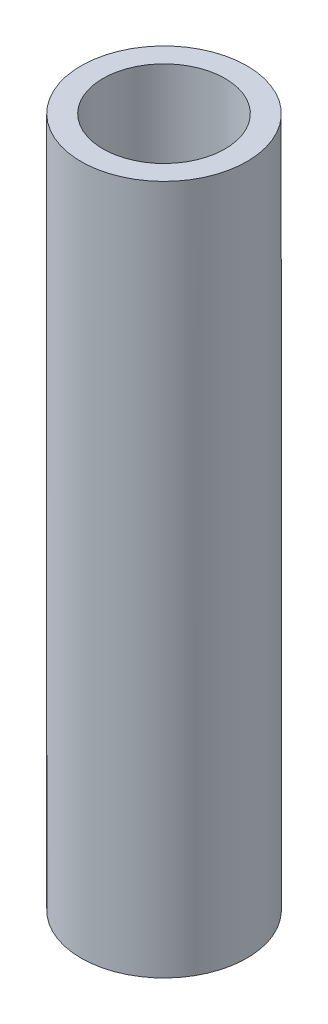
ISO-10303-21;
HEADER;
FILE_DESCRIPTION(('STEP AP214'),'2;1');
FILE_NAME('part.step','',(''),(''),'','','');
FILE_SCHEMA(('AUTOMOTIVE_DESIGN { 1 0 10303 214 1 1 1 1 }'));
ENDSEC;
DATA;
#1=APPLICATION_CONTEXT('core data for automotive mechanical design processes');
#2=APPLICATION_PROTOCOL_DEFINITION('international standard','automotive_design',2000,#1);
#3=PRODUCT_CONTEXT('',#1,'mechanical');
#4=PRODUCT('Part','Part','',(#3));
#5=PRODUCT_RELATED_PRODUCT_CATEGORY('part','',(#4));
#6=PRODUCT_DEFINITION_FORMATION('','',#4);
#7=PRODUCT_DEFINITION_CONTEXT('part definition',#1,'design');
#8=PRODUCT_DEFINITION('design','',#6,#7);
#9=PRODUCT_DEFINITION_SHAPE('','',#8);
#10=(LENGTH_UNIT() NAMED_UNIT(*) SI_UNIT(.MILLI.,.METRE.));
#11=(NAMED_UNIT(*) PLANE_ANGLE_UNIT() SI_UNIT($,.RADIAN.));
#12=(NAMED_UNIT(*) SI_UNIT($,.STERADIAN.) SOLID_ANGLE_UNIT());
#13=UNCERTAINTY_MEASURE_WITH_UNIT(LENGTH_MEASURE(1.E-05),#10,'distance_accuracy_value','');
#14=(GEOMETRIC_REPRESENTATION_CONTEXT(3) GLOBAL_UNCERTAINTY_ASSIGNED_CONTEXT((#13)) GLOBAL_UNIT_ASSIGNED_CONTEXT((#10,
#11,#12)) REPRESENTATION_CONTEXT('',''));
#15=CARTESIAN_POINT('',(0.,0.,0.));
#16=DIRECTION('',(0.,0.,1.));
#17=DIRECTION('',(1.,0.,0.));
#18=AXIS2_PLACEMENT_3D('',#15,#16,#17);
#19=CARTESIAN_POINT('',(0.,0.,0.));
#20=DIRECTION('',(0.,1.,0.));
#21=DIRECTION('',(0.,0.,1.));
#22=AXIS2_PLACEMENT_3D('',#19,#20,#21);
#23=PLANE('',#22);
#24=CARTESIAN_POINT('',(0.,0.,0.));
#25=DIRECTION('',(0.,1.,0.));
#26=DIRECTION('',(0.,0.,1.));
#27=AXIS2_PLACEMENT_3D('',#24,#25,#26);
#28=CIRCLE('',#27,5.55625);
#29=CARTESIAN_POINT('',(0.,0.,5.55625));
#30=VERTEX_POINT('',#29);
#31=EDGE_CURVE('E37',#30,#30,#28,.T.);
#32=ORIENTED_EDGE('',*,*,#31,.F.);
#33=EDGE_LOOP('',(#32));
#34=FACE_BOUND('',#33,.T.);
#35=CARTESIAN_POINT('',(0.,0.,0.));
#36=DIRECTION('',(0.,1.,0.));
#37=DIRECTION('',(0.,0.,1.));
#38=AXIS2_PLACEMENT_3D('',#35,#36,#37);
#39=CIRCLE('',#38,4.0894);
#40=CARTESIAN_POINT('',(0.,0.,4.0894));
#41=VERTEX_POINT('',#40);
#42=EDGE_CURVE('E46',#41,#41,#39,.T.);
#43=ORIENTED_EDGE('',*,*,#42,.T.);
#44=EDGE_LOOP('',(#43));
#45=FACE_BOUND('',#44,.T.);
#46=ADVANCED_FACE('F30',(#34,#45),#23,.F.);
#47=CARTESIAN_POINT('',(0.,61.915448211871,0.));
#48=DIRECTION('',(0.,-1.,0.));
#49=DIRECTION('',(0.,0.,-1.));
#50=AXIS2_PLACEMENT_3D('',#47,#48,#49);
#51=CYLINDRICAL_SURFACE('',#50,5.55625);
#52=CARTESIAN_POINT('',(0.,46.2,0.));
#53=DIRECTION('',(0.,-1.,0.));
#54=DIRECTION('',(0.,0.,-1.));
#55=AXIS2_PLACEMENT_3D('',#52,#53,#54);
#56=CIRCLE('',#55,5.55625);
#57=CARTESIAN_POINT('',(0.,46.2,-5.55625));
#58=VERTEX_POINT('',#57);
#59=EDGE_CURVE('E41',#58,#58,#56,.T.);
#60=ORIENTED_EDGE('',*,*,#59,.T.);
#61=EDGE_LOOP('',(#60));
#62=FACE_BOUND('',#61,.T.);
#63=ORIENTED_EDGE('',*,*,#31,.T.);
#64=EDGE_LOOP('',(#63));
#65=FACE_BOUND('',#64,.T.);
#66=ADVANCED_FACE('F54',(#62,#65),#51,.T.);
#67=CARTESIAN_POINT('',(0.,61.915448211871,0.));
#68=DIRECTION('',(0.,-1.,0.));
#69=DIRECTION('',(0.,0.,-1.));
#70=AXIS2_PLACEMENT_3D('',#67,#68,#69);
#71=CYLINDRICAL_SURFACE('',#70,4.0894);
#72=CARTESIAN_POINT('',(0.,46.2,0.));
#73=DIRECTION('',(0.,-1.,0.));
#74=DIRECTION('',(0.,0.,-1.));
#75=AXIS2_PLACEMENT_3D('',#72,#73,#74);
#76=CIRCLE('',#75,4.0894);
#77=CARTESIAN_POINT('',(0.,46.2,-4.0894));
#78=VERTEX_POINT('',#77);
#79=EDGE_CURVE('E10',#78,#78,#76,.T.);
#80=ORIENTED_EDGE('',*,*,#79,.F.);
#81=EDGE_LOOP('',(#80));
#82=FACE_BOUND('',#81,.T.);
#83=ORIENTED_EDGE('',*,*,#42,.F.);
#84=EDGE_LOOP('',(#83));
#85=FACE_BOUND('',#84,.T.);
#86=ADVANCED_FACE('F52',(#82,#85),#71,.F.);
#87=CARTESIAN_POINT('',(-1.14480171195884,46.2,11.0408074451236));
#88=DIRECTION('',(0.,-1.,0.));
#89=DIRECTION('',(0.103135289365661,0.,-0.99466733739852));
#90=AXIS2_PLACEMENT_3D('',#87,#88,#89);
#91=PLANE('',#90);
#92=ORIENTED_EDGE('',*,*,#79,.T.);
#93=EDGE_LOOP('',(#92));
#94=FACE_BOUND('',#93,.T.);
#95=ORIENTED_EDGE('',*,*,#59,.F.);
#96=EDGE_LOOP('',(#95));
#97=FACE_BOUND('',#96,.T.);
#98=ADVANCED_FACE('F32',(#94,#97),#91,.F.);
#99=CLOSED_SHELL('',(#46,#66,#86,#98));
#100=MANIFOLD_SOLID_BREP('B2',#99);
#101=ADVANCED_BREP_SHAPE_REPRESENTATION('',(#18,#100),#14);
#102=SHAPE_DEFINITION_REPRESENTATION(#9,#101);
ENDSEC;
END-ISO-10303-21;
